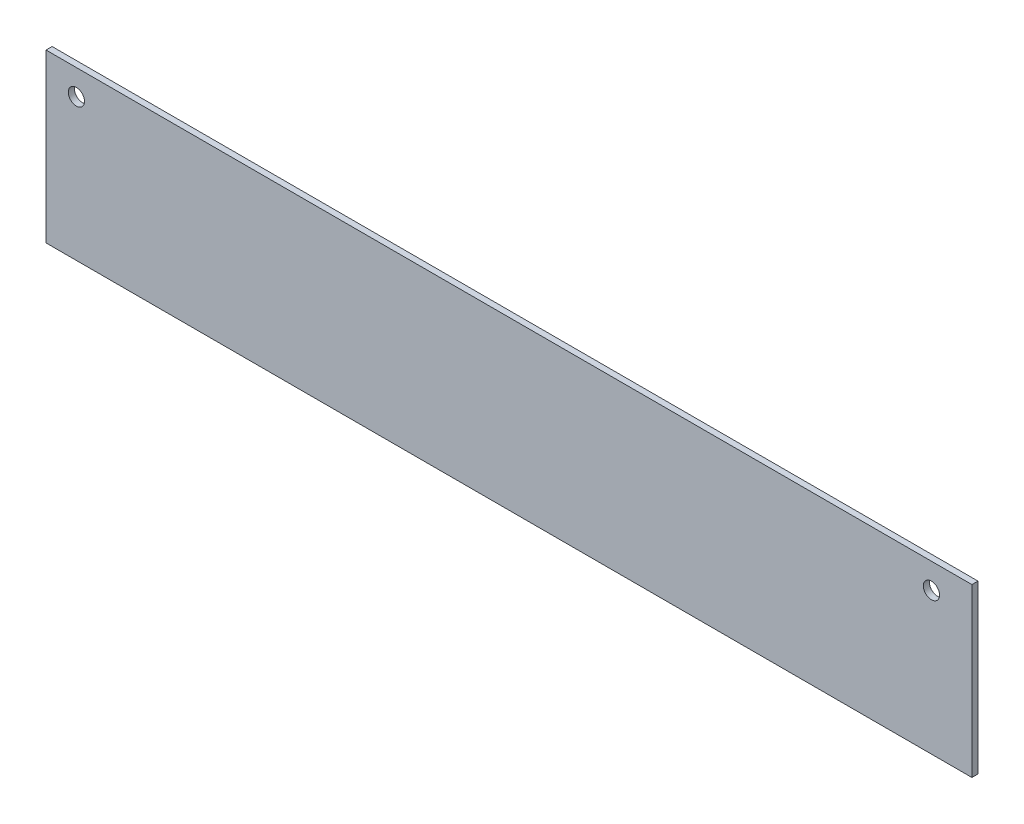
ISO-10303-21;
HEADER;
FILE_DESCRIPTION(('STEP AP214'),'2;1');
FILE_NAME('part.step','',(''),(''),'','','');
FILE_SCHEMA(('AUTOMOTIVE_DESIGN { 1 0 10303 214 1 1 1 1 }'));
ENDSEC;
DATA;
#1=APPLICATION_CONTEXT('core data for automotive mechanical design processes');
#2=APPLICATION_PROTOCOL_DEFINITION('international standard','automotive_design',2000,#1);
#3=PRODUCT_CONTEXT('',#1,'mechanical');
#4=PRODUCT('Part','Part','',(#3));
#5=PRODUCT_RELATED_PRODUCT_CATEGORY('part','',(#4));
#6=PRODUCT_DEFINITION_FORMATION('','',#4);
#7=PRODUCT_DEFINITION_CONTEXT('part definition',#1,'design');
#8=PRODUCT_DEFINITION('design','',#6,#7);
#9=PRODUCT_DEFINITION_SHAPE('','',#8);
#10=(LENGTH_UNIT() NAMED_UNIT(*) SI_UNIT(.MILLI.,.METRE.));
#11=(NAMED_UNIT(*) PLANE_ANGLE_UNIT() SI_UNIT($,.RADIAN.));
#12=(NAMED_UNIT(*) SI_UNIT($,.STERADIAN.) SOLID_ANGLE_UNIT());
#13=UNCERTAINTY_MEASURE_WITH_UNIT(LENGTH_MEASURE(1.E-05),#10,'distance_accuracy_value','');
#14=(GEOMETRIC_REPRESENTATION_CONTEXT(3) GLOBAL_UNCERTAINTY_ASSIGNED_CONTEXT((#13)) GLOBAL_UNIT_ASSIGNED_CONTEXT((#10,
#11,#12)) REPRESENTATION_CONTEXT('',''));
#15=CARTESIAN_POINT('',(0.,0.,0.));
#16=DIRECTION('',(0.,0.,1.));
#17=DIRECTION('',(1.,0.,0.));
#18=AXIS2_PLACEMENT_3D('',#15,#16,#17);
#19=CARTESIAN_POINT('',(228.6,41.25,3.));
#20=DIRECTION('',(-1.,0.,0.));
#21=DIRECTION('',(0.,0.,1.));
#22=AXIS2_PLACEMENT_3D('',#19,#20,#21);
#23=PLANE('',#22);
#24=DIRECTION('',(0.,1.,0.));
#25=VECTOR('',#24,1.);
#26=CARTESIAN_POINT('',(228.6,41.25,0.));
#27=LINE('',#26,#25);
#28=CARTESIAN_POINT('',(228.6,-41.25,0.));
#29=VERTEX_POINT('',#28);
#30=CARTESIAN_POINT('',(228.6,41.25,0.));
#31=VERTEX_POINT('',#30);
#32=EDGE_CURVE('E95',#29,#31,#27,.T.);
#33=ORIENTED_EDGE('',*,*,#32,.T.);
#34=DIRECTION('',(0.,0.,-1.));
#35=VECTOR('',#34,1.);
#36=CARTESIAN_POINT('',(228.6,41.25,3.));
#37=LINE('',#36,#35);
#38=CARTESIAN_POINT('',(228.6,41.25,3.));
#39=VERTEX_POINT('',#38);
#40=EDGE_CURVE('E11',#39,#31,#37,.T.);
#41=ORIENTED_EDGE('',*,*,#40,.F.);
#42=DIRECTION('',(0.,1.,0.));
#43=VECTOR('',#42,1.);
#44=CARTESIAN_POINT('',(228.6,41.25,3.));
#45=LINE('',#44,#43);
#46=CARTESIAN_POINT('',(228.6,-41.25,3.));
#47=VERTEX_POINT('',#46);
#48=EDGE_CURVE('E83',#47,#39,#45,.T.);
#49=ORIENTED_EDGE('',*,*,#48,.F.);
#50=DIRECTION('',(0.,0.,-1.));
#51=VECTOR('',#50,1.);
#52=CARTESIAN_POINT('',(228.6,-41.25,3.));
#53=LINE('',#52,#51);
#54=EDGE_CURVE('E91',#47,#29,#53,.T.);
#55=ORIENTED_EDGE('',*,*,#54,.T.);
#56=EDGE_LOOP('',(#33,#41,#49,#55));
#57=FACE_BOUND('',#56,.T.);
#58=ADVANCED_FACE('F32',(#57),#23,.F.);
#59=CARTESIAN_POINT('',(-228.6,41.25,3.));
#60=DIRECTION('',(0.,-1.,0.));
#61=DIRECTION('',(0.,0.,-1.));
#62=AXIS2_PLACEMENT_3D('',#59,#60,#61);
#63=PLANE('',#62);
#64=DIRECTION('',(-1.,0.,0.));
#65=VECTOR('',#64,1.);
#66=CARTESIAN_POINT('',(-228.6,41.25,0.));
#67=LINE('',#66,#65);
#68=CARTESIAN_POINT('',(-228.6,41.25,0.));
#69=VERTEX_POINT('',#68);
#70=EDGE_CURVE('E87',#31,#69,#67,.T.);
#71=ORIENTED_EDGE('',*,*,#70,.T.);
#72=DIRECTION('',(0.,0.,-1.));
#73=VECTOR('',#72,1.);
#74=CARTESIAN_POINT('',(-228.6,41.25,3.));
#75=LINE('',#74,#73);
#76=CARTESIAN_POINT('',(-228.6,41.25,3.));
#77=VERTEX_POINT('',#76);
#78=EDGE_CURVE('E40',#77,#69,#75,.T.);
#79=ORIENTED_EDGE('',*,*,#78,.F.);
#80=DIRECTION('',(-1.,0.,0.));
#81=VECTOR('',#80,1.);
#82=CARTESIAN_POINT('',(-228.6,41.25,3.));
#83=LINE('',#82,#81);
#84=EDGE_CURVE('E78',#39,#77,#83,.T.);
#85=ORIENTED_EDGE('',*,*,#84,.F.);
#86=ORIENTED_EDGE('',*,*,#40,.T.);
#87=EDGE_LOOP('',(#71,#79,#85,#86));
#88=FACE_BOUND('',#87,.T.);
#89=ADVANCED_FACE('F86',(#88),#63,.F.);
#90=CARTESIAN_POINT('',(-228.6,41.25,3.));
#91=DIRECTION('',(1.,0.,0.));
#92=DIRECTION('',(0.,0.,-1.));
#93=AXIS2_PLACEMENT_3D('',#90,#91,#92);
#94=PLANE('',#93);
#95=DIRECTION('',(0.,-1.,0.));
#96=VECTOR('',#95,1.);
#97=CARTESIAN_POINT('',(-228.6,41.25,0.));
#98=LINE('',#97,#96);
#99=CARTESIAN_POINT('',(-228.6,-41.25,0.));
#100=VERTEX_POINT('',#99);
#101=EDGE_CURVE('E65',#69,#100,#98,.T.);
#102=ORIENTED_EDGE('',*,*,#101,.T.);
#103=DIRECTION('',(0.,0.,-1.));
#104=VECTOR('',#103,1.);
#105=CARTESIAN_POINT('',(-228.6,-41.25,3.));
#106=LINE('',#105,#104);
#107=CARTESIAN_POINT('',(-228.6,-41.25,3.));
#108=VERTEX_POINT('',#107);
#109=EDGE_CURVE('E88',#108,#100,#106,.T.);
#110=ORIENTED_EDGE('',*,*,#109,.F.);
#111=DIRECTION('',(0.,-1.,0.));
#112=VECTOR('',#111,1.);
#113=CARTESIAN_POINT('',(-228.6,41.25,3.));
#114=LINE('',#113,#112);
#115=EDGE_CURVE('E81',#77,#108,#114,.T.);
#116=ORIENTED_EDGE('',*,*,#115,.F.);
#117=ORIENTED_EDGE('',*,*,#78,.T.);
#118=EDGE_LOOP('',(#102,#110,#116,#117));
#119=FACE_BOUND('',#118,.T.);
#120=ADVANCED_FACE('F89',(#119),#94,.F.);
#121=CARTESIAN_POINT('',(-228.6,-41.25,3.));
#122=DIRECTION('',(0.,1.,0.));
#123=DIRECTION('',(0.,0.,1.));
#124=AXIS2_PLACEMENT_3D('',#121,#122,#123);
#125=PLANE('',#124);
#126=DIRECTION('',(1.,0.,0.));
#127=VECTOR('',#126,1.);
#128=CARTESIAN_POINT('',(-228.6,-41.25,0.));
#129=LINE('',#128,#127);
#130=EDGE_CURVE('E71',#100,#29,#129,.T.);
#131=ORIENTED_EDGE('',*,*,#130,.T.);
#132=ORIENTED_EDGE('',*,*,#54,.F.);
#133=DIRECTION('',(1.,0.,0.));
#134=VECTOR('',#133,1.);
#135=CARTESIAN_POINT('',(-228.6,-41.25,3.));
#136=LINE('',#135,#134);
#137=EDGE_CURVE('E48',#108,#47,#136,.T.);
#138=ORIENTED_EDGE('',*,*,#137,.F.);
#139=ORIENTED_EDGE('',*,*,#109,.T.);
#140=EDGE_LOOP('',(#131,#132,#138,#139));
#141=FACE_BOUND('',#140,.T.);
#142=ADVANCED_FACE('F103',(#141),#125,.F.);
#143=CARTESIAN_POINT('',(0.,0.,3.));
#144=DIRECTION('',(0.,0.,1.));
#145=DIRECTION('',(1.,0.,0.));
#146=AXIS2_PLACEMENT_3D('',#143,#144,#145);
#147=PLANE('',#146);
#148=CARTESIAN_POINT('',(208.6,28.75,3.));
#149=DIRECTION('',(0.,0.,1.));
#150=DIRECTION('',(1.,0.,0.));
#151=AXIS2_PLACEMENT_3D('',#148,#149,#150);
#152=CIRCLE('',#151,3.99999999999999);
#153=CARTESIAN_POINT('',(212.6,28.75,3.));
#154=VERTEX_POINT('',#153);
#155=EDGE_CURVE('E115',#154,#154,#152,.T.);
#156=ORIENTED_EDGE('',*,*,#155,.F.);
#157=EDGE_LOOP('',(#156));
#158=FACE_BOUND('',#157,.T.);
#159=CARTESIAN_POINT('',(-213.6,28.75,3.));
#160=DIRECTION('',(0.,0.,1.));
#161=DIRECTION('',(1.,0.,0.));
#162=AXIS2_PLACEMENT_3D('',#159,#160,#161);
#163=CIRCLE('',#162,3.99999999999999);
#164=CARTESIAN_POINT('',(-209.6,28.75,3.));
#165=VERTEX_POINT('',#164);
#166=EDGE_CURVE('E109',#165,#165,#163,.T.);
#167=ORIENTED_EDGE('',*,*,#166,.F.);
#168=EDGE_LOOP('',(#167));
#169=FACE_BOUND('',#168,.T.);
#170=ORIENTED_EDGE('',*,*,#48,.T.);
#171=ORIENTED_EDGE('',*,*,#84,.T.);
#172=ORIENTED_EDGE('',*,*,#115,.T.);
#173=ORIENTED_EDGE('',*,*,#137,.T.);
#174=EDGE_LOOP('',(#170,#171,#172,#173));
#175=FACE_BOUND('',#174,.T.);
#176=ADVANCED_FACE('F79',(#158,#169,#175),#147,.T.);
#177=CARTESIAN_POINT('',(0.,0.,0.));
#178=DIRECTION('',(0.,0.,1.));
#179=DIRECTION('',(1.,0.,0.));
#180=AXIS2_PLACEMENT_3D('',#177,#178,#179);
#181=PLANE('',#180);
#182=CARTESIAN_POINT('',(208.6,28.75,0.));
#183=DIRECTION('',(0.,0.,1.));
#184=DIRECTION('',(1.,0.,0.));
#185=AXIS2_PLACEMENT_3D('',#182,#183,#184);
#186=CIRCLE('',#185,3.99999999999999);
#187=CARTESIAN_POINT('',(212.6,28.75,0.));
#188=VERTEX_POINT('',#187);
#189=EDGE_CURVE('E112',#188,#188,#186,.T.);
#190=ORIENTED_EDGE('',*,*,#189,.T.);
#191=EDGE_LOOP('',(#190));
#192=FACE_BOUND('',#191,.T.);
#193=CARTESIAN_POINT('',(-213.6,28.75,0.));
#194=DIRECTION('',(0.,0.,1.));
#195=DIRECTION('',(1.,0.,0.));
#196=AXIS2_PLACEMENT_3D('',#193,#194,#195);
#197=CIRCLE('',#196,3.99999999999999);
#198=CARTESIAN_POINT('',(-209.6,28.75,0.));
#199=VERTEX_POINT('',#198);
#200=EDGE_CURVE('E98',#199,#199,#197,.T.);
#201=ORIENTED_EDGE('',*,*,#200,.T.);
#202=EDGE_LOOP('',(#201));
#203=FACE_BOUND('',#202,.T.);
#204=ORIENTED_EDGE('',*,*,#32,.F.);
#205=ORIENTED_EDGE('',*,*,#130,.F.);
#206=ORIENTED_EDGE('',*,*,#101,.F.);
#207=ORIENTED_EDGE('',*,*,#70,.F.);
#208=EDGE_LOOP('',(#204,#205,#206,#207));
#209=FACE_BOUND('',#208,.T.);
#210=ADVANCED_FACE('F106',(#192,#203,#209),#181,.F.);
#211=CARTESIAN_POINT('',(-213.6,28.75,0.));
#212=DIRECTION('',(0.,0.,1.));
#213=DIRECTION('',(1.,0.,0.));
#214=AXIS2_PLACEMENT_3D('',#211,#212,#213);
#215=CYLINDRICAL_SURFACE('',#214,3.99999999999999);
#216=ORIENTED_EDGE('',*,*,#200,.F.);
#217=EDGE_LOOP('',(#216));
#218=FACE_BOUND('',#217,.T.);
#219=ORIENTED_EDGE('',*,*,#166,.T.);
#220=EDGE_LOOP('',(#219));
#221=FACE_BOUND('',#220,.T.);
#222=ADVANCED_FACE('F126',(#218,#221),#215,.F.);
#223=CARTESIAN_POINT('',(208.6,28.75,0.));
#224=DIRECTION('',(0.,0.,1.));
#225=DIRECTION('',(1.,0.,0.));
#226=AXIS2_PLACEMENT_3D('',#223,#224,#225);
#227=CYLINDRICAL_SURFACE('',#226,3.99999999999999);
#228=ORIENTED_EDGE('',*,*,#189,.F.);
#229=EDGE_LOOP('',(#228));
#230=FACE_BOUND('',#229,.T.);
#231=ORIENTED_EDGE('',*,*,#155,.T.);
#232=EDGE_LOOP('',(#231));
#233=FACE_BOUND('',#232,.T.);
#234=ADVANCED_FACE('F123',(#230,#233),#227,.F.);
#235=CLOSED_SHELL('',(#58,#89,#120,#142,#176,#210,#222,#234));
#236=MANIFOLD_SOLID_BREP('B2',#235);
#237=ADVANCED_BREP_SHAPE_REPRESENTATION('',(#18,#236),#14);
#238=SHAPE_DEFINITION_REPRESENTATION(#9,#237);
ENDSEC;
END-ISO-10303-21;
